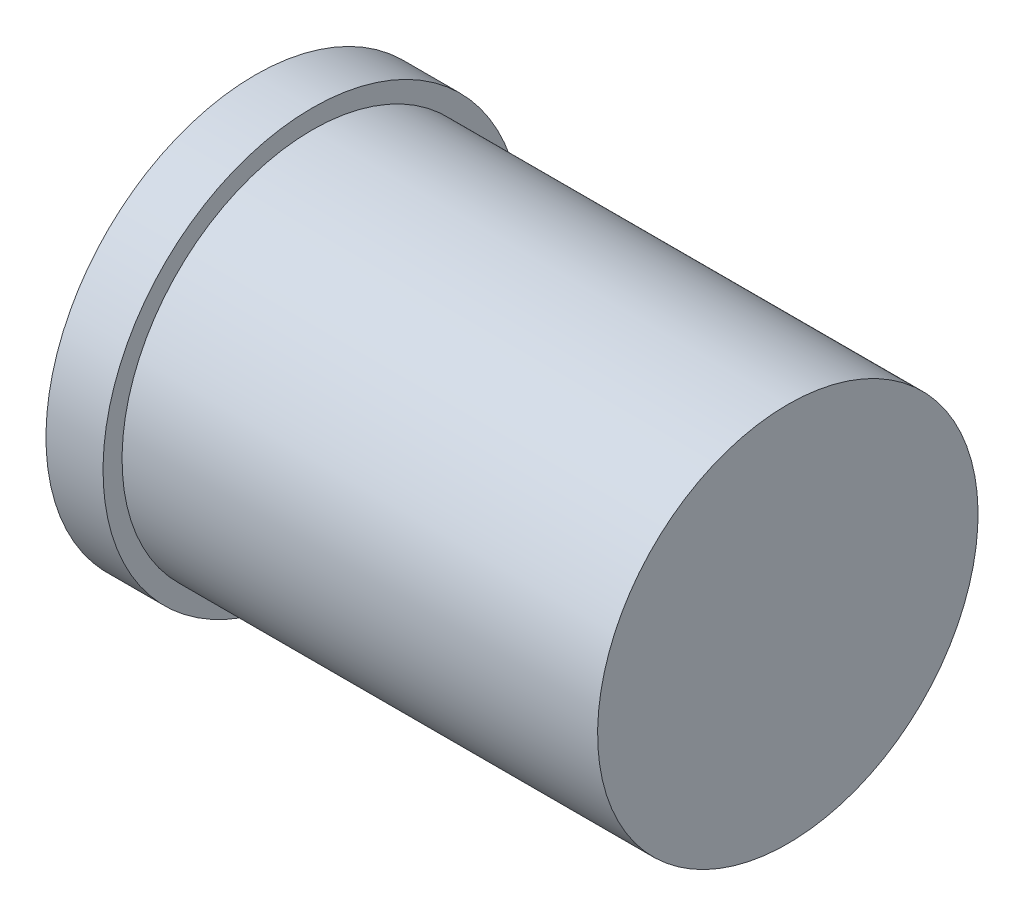
ISO-10303-21;
HEADER;
FILE_DESCRIPTION(('STEP AP214'),'2;1');
FILE_NAME('part.step','',(''),(''),'','','');
FILE_SCHEMA(('AUTOMOTIVE_DESIGN { 1 0 10303 214 1 1 1 1 }'));
ENDSEC;
DATA;
#1=APPLICATION_CONTEXT('core data for automotive mechanical design processes');
#2=APPLICATION_PROTOCOL_DEFINITION('international standard','automotive_design',2000,#1);
#3=PRODUCT_CONTEXT('',#1,'mechanical');
#4=PRODUCT('Part','Part','',(#3));
#5=PRODUCT_RELATED_PRODUCT_CATEGORY('part','',(#4));
#6=PRODUCT_DEFINITION_FORMATION('','',#4);
#7=PRODUCT_DEFINITION_CONTEXT('part definition',#1,'design');
#8=PRODUCT_DEFINITION('design','',#6,#7);
#9=PRODUCT_DEFINITION_SHAPE('','',#8);
#10=(LENGTH_UNIT() NAMED_UNIT(*) SI_UNIT(.MILLI.,.METRE.));
#11=(NAMED_UNIT(*) PLANE_ANGLE_UNIT() SI_UNIT($,.RADIAN.));
#12=(NAMED_UNIT(*) SI_UNIT($,.STERADIAN.) SOLID_ANGLE_UNIT());
#13=UNCERTAINTY_MEASURE_WITH_UNIT(LENGTH_MEASURE(1.E-05),#10,'distance_accuracy_value','');
#14=(GEOMETRIC_REPRESENTATION_CONTEXT(3) GLOBAL_UNCERTAINTY_ASSIGNED_CONTEXT((#13)) GLOBAL_UNIT_ASSIGNED_CONTEXT((#10,
#11,#12)) REPRESENTATION_CONTEXT('',''));
#15=CARTESIAN_POINT('',(0.,0.,0.));
#16=DIRECTION('',(0.,0.,1.));
#17=DIRECTION('',(1.,0.,0.));
#18=AXIS2_PLACEMENT_3D('',#15,#16,#17);
#19=CARTESIAN_POINT('',(0.,0.,0.));
#20=DIRECTION('',(-1.,0.,0.));
#21=DIRECTION('',(0.,-1.,0.));
#22=AXIS2_PLACEMENT_3D('',#19,#20,#21);
#23=PLANE('',#22);
#24=CARTESIAN_POINT('',(0.,0.,0.));
#25=DIRECTION('',(1.,0.,0.));
#26=DIRECTION('',(0.,1.,0.));
#27=AXIS2_PLACEMENT_3D('',#24,#25,#26);
#28=CIRCLE('',#27,11.);
#29=CARTESIAN_POINT('',(0.,11.,0.));
#30=VERTEX_POINT('',#29);
#31=EDGE_CURVE('E10',#30,#30,#28,.T.);
#32=ORIENTED_EDGE('',*,*,#31,.F.);
#33=EDGE_LOOP('',(#32));
#34=FACE_BOUND('',#33,.T.);
#35=ADVANCED_FACE('F31',(#34),#23,.T.);
#36=CARTESIAN_POINT('',(28.,0.,0.));
#37=DIRECTION('',(1.,0.,0.));
#38=DIRECTION('',(0.,1.,0.));
#39=AXIS2_PLACEMENT_3D('',#36,#37,#38);
#40=CYLINDRICAL_SURFACE('',#39,11.);
#41=ORIENTED_EDGE('',*,*,#31,.T.);
#42=EDGE_LOOP('',(#41));
#43=FACE_BOUND('',#42,.T.);
#44=CARTESIAN_POINT('',(3.,0.,0.));
#45=DIRECTION('',(1.,0.,0.));
#46=DIRECTION('',(0.,1.,0.));
#47=AXIS2_PLACEMENT_3D('',#44,#45,#46);
#48=CIRCLE('',#47,11.);
#49=CARTESIAN_POINT('',(3.,11.,0.));
#50=VERTEX_POINT('',#49);
#51=EDGE_CURVE('E37',#50,#50,#48,.T.);
#52=ORIENTED_EDGE('',*,*,#51,.F.);
#53=EDGE_LOOP('',(#52));
#54=FACE_BOUND('',#53,.T.);
#55=ADVANCED_FACE('F63',(#43,#54),#40,.T.);
#56=CARTESIAN_POINT('',(3.,11.,0.));
#57=DIRECTION('',(1.,0.,0.));
#58=DIRECTION('',(0.,1.,0.));
#59=AXIS2_PLACEMENT_3D('',#56,#57,#58);
#60=PLANE('',#59);
#61=ORIENTED_EDGE('',*,*,#51,.T.);
#62=EDGE_LOOP('',(#61));
#63=FACE_BOUND('',#62,.T.);
#64=CARTESIAN_POINT('',(3.,0.,0.));
#65=DIRECTION('',(1.,0.,0.));
#66=DIRECTION('',(0.,1.,0.));
#67=AXIS2_PLACEMENT_3D('',#64,#65,#66);
#68=CIRCLE('',#67,10.);
#69=CARTESIAN_POINT('',(3.,10.,0.));
#70=VERTEX_POINT('',#69);
#71=EDGE_CURVE('E41',#70,#70,#68,.T.);
#72=ORIENTED_EDGE('',*,*,#71,.F.);
#73=EDGE_LOOP('',(#72));
#74=FACE_BOUND('',#73,.T.);
#75=ADVANCED_FACE('F55',(#63,#74),#60,.T.);
#76=CARTESIAN_POINT('',(28.,0.,0.));
#77=DIRECTION('',(1.,0.,0.));
#78=DIRECTION('',(0.,1.,0.));
#79=AXIS2_PLACEMENT_3D('',#76,#77,#78);
#80=CYLINDRICAL_SURFACE('',#79,10.);
#81=ORIENTED_EDGE('',*,*,#71,.T.);
#82=EDGE_LOOP('',(#81));
#83=FACE_BOUND('',#82,.T.);
#84=CARTESIAN_POINT('',(28.,0.,0.));
#85=DIRECTION('',(1.,0.,0.));
#86=DIRECTION('',(0.,1.,0.));
#87=AXIS2_PLACEMENT_3D('',#84,#85,#86);
#88=CIRCLE('',#87,10.);
#89=CARTESIAN_POINT('',(28.,10.,0.));
#90=VERTEX_POINT('',#89);
#91=EDGE_CURVE('E45',#90,#90,#88,.T.);
#92=ORIENTED_EDGE('',*,*,#91,.F.);
#93=EDGE_LOOP('',(#92));
#94=FACE_BOUND('',#93,.T.);
#95=ADVANCED_FACE('F53',(#83,#94),#80,.T.);
#96=CARTESIAN_POINT('',(28.,10.,0.));
#97=DIRECTION('',(1.,0.,0.));
#98=DIRECTION('',(0.,1.,0.));
#99=AXIS2_PLACEMENT_3D('',#96,#97,#98);
#100=PLANE('',#99);
#101=ORIENTED_EDGE('',*,*,#91,.T.);
#102=EDGE_LOOP('',(#101));
#103=FACE_BOUND('',#102,.T.);
#104=ADVANCED_FACE('F51',(#103),#100,.T.);
#105=CLOSED_SHELL('',(#35,#55,#75,#95,#104));
#106=MANIFOLD_SOLID_BREP('B2',#105);
#107=ADVANCED_BREP_SHAPE_REPRESENTATION('',(#18,#106),#14);
#108=SHAPE_DEFINITION_REPRESENTATION(#9,#107);
ENDSEC;
END-ISO-10303-21;
